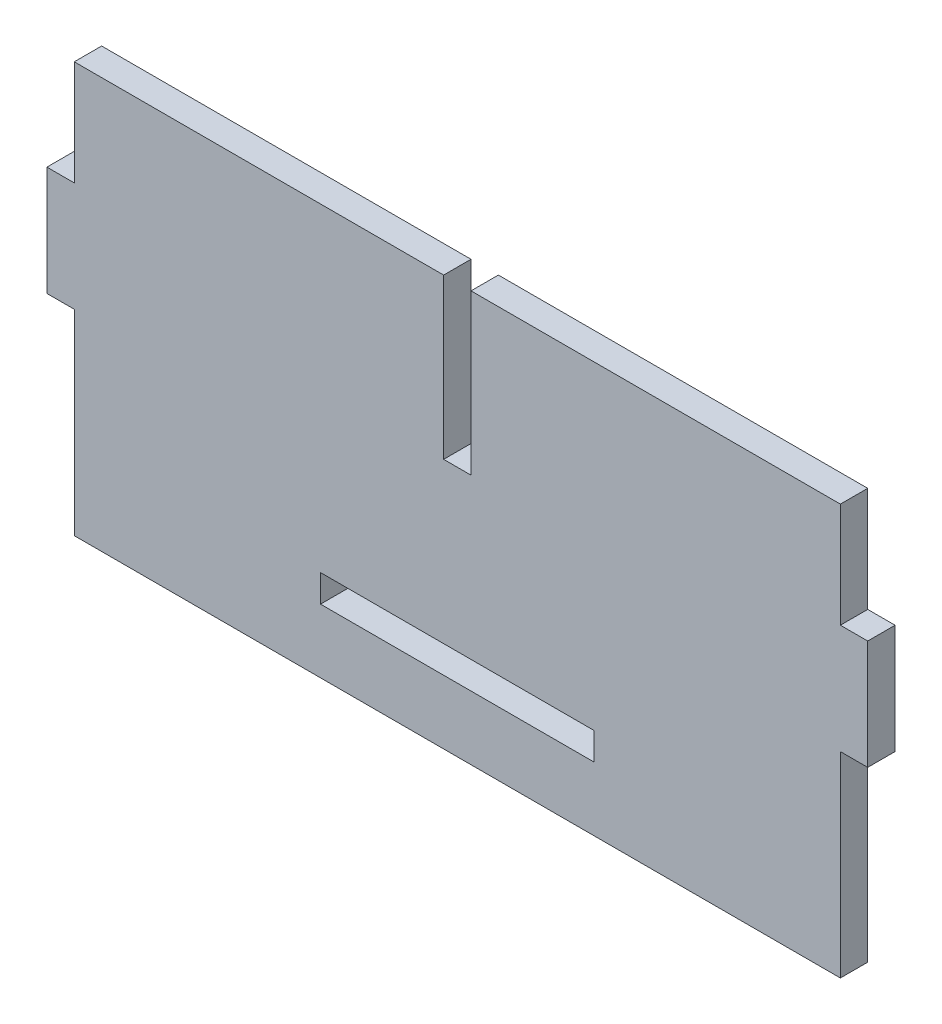
ISO-10303-21;
HEADER;
FILE_DESCRIPTION(('STEP AP214'),'2;1');
FILE_NAME('part.step','',(''),(''),'','','');
FILE_SCHEMA(('AUTOMOTIVE_DESIGN { 1 0 10303 214 1 1 1 1 }'));
ENDSEC;
DATA;
#1=APPLICATION_CONTEXT('core data for automotive mechanical design processes');
#2=APPLICATION_PROTOCOL_DEFINITION('international standard','automotive_design',2000,#1);
#3=PRODUCT_CONTEXT('',#1,'mechanical');
#4=PRODUCT('Part','Part','',(#3));
#5=PRODUCT_RELATED_PRODUCT_CATEGORY('part','',(#4));
#6=PRODUCT_DEFINITION_FORMATION('','',#4);
#7=PRODUCT_DEFINITION_CONTEXT('part definition',#1,'design');
#8=PRODUCT_DEFINITION('design','',#6,#7);
#9=PRODUCT_DEFINITION_SHAPE('','',#8);
#10=(LENGTH_UNIT() NAMED_UNIT(*) SI_UNIT(.MILLI.,.METRE.));
#11=(NAMED_UNIT(*) PLANE_ANGLE_UNIT() SI_UNIT($,.RADIAN.));
#12=(NAMED_UNIT(*) SI_UNIT($,.STERADIAN.) SOLID_ANGLE_UNIT());
#13=UNCERTAINTY_MEASURE_WITH_UNIT(LENGTH_MEASURE(1.E-05),#10,'distance_accuracy_value','');
#14=(GEOMETRIC_REPRESENTATION_CONTEXT(3) GLOBAL_UNCERTAINTY_ASSIGNED_CONTEXT((#13)) GLOBAL_UNIT_ASSIGNED_CONTEXT((#10,
#11,#12)) REPRESENTATION_CONTEXT('',''));
#15=CARTESIAN_POINT('',(0.,0.,0.));
#16=DIRECTION('',(0.,0.,1.));
#17=DIRECTION('',(1.,0.,0.));
#18=AXIS2_PLACEMENT_3D('',#15,#16,#17);
#19=CARTESIAN_POINT('',(1.5,0.,3.));
#20=DIRECTION('',(-1.,0.,0.));
#21=DIRECTION('',(0.,0.,1.));
#22=AXIS2_PLACEMENT_3D('',#19,#20,#21);
#23=PLANE('',#22);
#24=DIRECTION('',(0.,1.,0.));
#25=VECTOR('',#24,1.);
#26=CARTESIAN_POINT('',(1.5,0.,0.));
#27=LINE('',#26,#25);
#28=CARTESIAN_POINT('',(1.5,5.,0.));
#29=VERTEX_POINT('',#28);
#30=CARTESIAN_POINT('',(1.5,22.5,0.));
#31=VERTEX_POINT('',#30);
#32=EDGE_CURVE('E284',#29,#31,#27,.T.);
#33=ORIENTED_EDGE('',*,*,#32,.F.);
#34=DIRECTION('',(0.,0.,-1.));
#35=VECTOR('',#34,1.);
#36=CARTESIAN_POINT('',(1.5,5.,3.));
#37=LINE('',#36,#35);
#38=CARTESIAN_POINT('',(1.5,5.,3.));
#39=VERTEX_POINT('',#38);
#40=EDGE_CURVE('E11',#39,#29,#37,.T.);
#41=ORIENTED_EDGE('',*,*,#40,.F.);
#42=DIRECTION('',(0.,1.,0.));
#43=VECTOR('',#42,1.);
#44=CARTESIAN_POINT('',(1.5,0.,3.));
#45=LINE('',#44,#43);
#46=CARTESIAN_POINT('',(1.5,22.5,3.));
#47=VERTEX_POINT('',#46);
#48=EDGE_CURVE('E328',#39,#47,#45,.T.);
#49=ORIENTED_EDGE('',*,*,#48,.T.);
#50=DIRECTION('',(0.,0.,-1.));
#51=VECTOR('',#50,1.);
#52=CARTESIAN_POINT('',(1.5,22.5,3.));
#53=LINE('',#52,#51);
#54=EDGE_CURVE('E54',#47,#31,#53,.T.);
#55=ORIENTED_EDGE('',*,*,#54,.T.);
#56=EDGE_LOOP('',(#33,#41,#49,#55));
#57=FACE_BOUND('',#56,.T.);
#58=ADVANCED_FACE('F35',(#57),#23,.T.);
#59=CARTESIAN_POINT('',(0.,5.,3.));
#60=DIRECTION('',(0.,1.,0.));
#61=DIRECTION('',(0.,0.,1.));
#62=AXIS2_PLACEMENT_3D('',#59,#60,#61);
#63=PLANE('',#62);
#64=DIRECTION('',(1.,0.,0.));
#65=VECTOR('',#64,1.);
#66=CARTESIAN_POINT('',(0.,5.,0.));
#67=LINE('',#66,#65);
#68=CARTESIAN_POINT('',(-1.5,5.,0.));
#69=VERTEX_POINT('',#68);
#70=EDGE_CURVE('E281',#69,#29,#67,.T.);
#71=ORIENTED_EDGE('',*,*,#70,.F.);
#72=DIRECTION('',(0.,0.,-1.));
#73=VECTOR('',#72,1.);
#74=CARTESIAN_POINT('',(-1.5,5.,3.));
#75=LINE('',#74,#73);
#76=CARTESIAN_POINT('',(-1.5,5.,3.));
#77=VERTEX_POINT('',#76);
#78=EDGE_CURVE('E45',#77,#69,#75,.T.);
#79=ORIENTED_EDGE('',*,*,#78,.F.);
#80=DIRECTION('',(1.,0.,0.));
#81=VECTOR('',#80,1.);
#82=CARTESIAN_POINT('',(0.,5.,3.));
#83=LINE('',#82,#81);
#84=EDGE_CURVE('E325',#77,#39,#83,.T.);
#85=ORIENTED_EDGE('',*,*,#84,.T.);
#86=ORIENTED_EDGE('',*,*,#40,.T.);
#87=EDGE_LOOP('',(#71,#79,#85,#86));
#88=FACE_BOUND('',#87,.T.);
#89=ADVANCED_FACE('F361',(#88),#63,.T.);
#90=CARTESIAN_POINT('',(-1.5,0.,3.));
#91=DIRECTION('',(-1.,0.,0.));
#92=DIRECTION('',(0.,0.,1.));
#93=AXIS2_PLACEMENT_3D('',#90,#91,#92);
#94=PLANE('',#93);
#95=DIRECTION('',(0.,1.,0.));
#96=VECTOR('',#95,1.);
#97=CARTESIAN_POINT('',(-1.5,0.,0.));
#98=LINE('',#97,#96);
#99=CARTESIAN_POINT('',(-1.5,22.5,0.));
#100=VERTEX_POINT('',#99);
#101=EDGE_CURVE('E278',#69,#100,#98,.T.);
#102=ORIENTED_EDGE('',*,*,#101,.T.);
#103=DIRECTION('',(0.,0.,-1.));
#104=VECTOR('',#103,1.);
#105=CARTESIAN_POINT('',(-1.5,22.5,3.));
#106=LINE('',#105,#104);
#107=CARTESIAN_POINT('',(-1.5,22.5,3.));
#108=VERTEX_POINT('',#107);
#109=EDGE_CURVE('E229',#108,#100,#106,.T.);
#110=ORIENTED_EDGE('',*,*,#109,.F.);
#111=DIRECTION('',(0.,1.,0.));
#112=VECTOR('',#111,1.);
#113=CARTESIAN_POINT('',(-1.5,0.,3.));
#114=LINE('',#113,#112);
#115=EDGE_CURVE('E323',#77,#108,#114,.T.);
#116=ORIENTED_EDGE('',*,*,#115,.F.);
#117=ORIENTED_EDGE('',*,*,#78,.T.);
#118=EDGE_LOOP('',(#102,#110,#116,#117));
#119=FACE_BOUND('',#118,.T.);
#120=ADVANCED_FACE('F358',(#119),#94,.F.);
#121=CARTESIAN_POINT('',(0.,22.5,3.));
#122=DIRECTION('',(0.,1.,0.));
#123=DIRECTION('',(-1.,0.,0.));
#124=AXIS2_PLACEMENT_3D('',#121,#122,#123);
#125=PLANE('',#124);
#126=DIRECTION('',(1.,0.,0.));
#127=VECTOR('',#126,1.);
#128=CARTESIAN_POINT('',(0.,22.5,0.));
#129=LINE('',#128,#127);
#130=CARTESIAN_POINT('',(-42.,22.5,0.));
#131=VERTEX_POINT('',#130);
#132=EDGE_CURVE('E275',#131,#100,#129,.T.);
#133=ORIENTED_EDGE('',*,*,#132,.F.);
#134=DIRECTION('',(0.,0.,-1.));
#135=VECTOR('',#134,1.);
#136=CARTESIAN_POINT('',(-42.,22.5,3.));
#137=LINE('',#136,#135);
#138=CARTESIAN_POINT('',(-42.,22.5,3.));
#139=VERTEX_POINT('',#138);
#140=EDGE_CURVE('E227',#139,#131,#137,.T.);
#141=ORIENTED_EDGE('',*,*,#140,.F.);
#142=DIRECTION('',(1.,0.,0.));
#143=VECTOR('',#142,1.);
#144=CARTESIAN_POINT('',(0.,22.5,3.));
#145=LINE('',#144,#143);
#146=EDGE_CURVE('E320',#139,#108,#145,.T.);
#147=ORIENTED_EDGE('',*,*,#146,.T.);
#148=ORIENTED_EDGE('',*,*,#109,.T.);
#149=EDGE_LOOP('',(#133,#141,#147,#148));
#150=FACE_BOUND('',#149,.T.);
#151=ADVANCED_FACE('F344',(#150),#125,.T.);
#152=CARTESIAN_POINT('',(-42.,0.,3.));
#153=DIRECTION('',(1.,0.,0.));
#154=DIRECTION('',(0.,0.,-1.));
#155=AXIS2_PLACEMENT_3D('',#152,#153,#154);
#156=PLANE('',#155);
#157=DIRECTION('',(0.,-1.,0.));
#158=VECTOR('',#157,1.);
#159=CARTESIAN_POINT('',(-42.,0.,0.));
#160=LINE('',#159,#158);
#161=CARTESIAN_POINT('',(-42.,11.,0.));
#162=VERTEX_POINT('',#161);
#163=EDGE_CURVE('E272',#131,#162,#160,.T.);
#164=ORIENTED_EDGE('',*,*,#163,.T.);
#165=DIRECTION('',(0.,0.,-1.));
#166=VECTOR('',#165,1.);
#167=CARTESIAN_POINT('',(-42.,11.,3.));
#168=LINE('',#167,#166);
#169=CARTESIAN_POINT('',(-42.,11.,3.));
#170=VERTEX_POINT('',#169);
#171=EDGE_CURVE('E224',#170,#162,#168,.T.);
#172=ORIENTED_EDGE('',*,*,#171,.F.);
#173=DIRECTION('',(0.,-1.,0.));
#174=VECTOR('',#173,1.);
#175=CARTESIAN_POINT('',(-42.,0.,3.));
#176=LINE('',#175,#174);
#177=EDGE_CURVE('E317',#139,#170,#176,.T.);
#178=ORIENTED_EDGE('',*,*,#177,.F.);
#179=ORIENTED_EDGE('',*,*,#140,.T.);
#180=EDGE_LOOP('',(#164,#172,#178,#179));
#181=FACE_BOUND('',#180,.T.);
#182=ADVANCED_FACE('F357',(#181),#156,.F.);
#183=CARTESIAN_POINT('',(0.,11.,3.));
#184=DIRECTION('',(0.,-1.,0.));
#185=DIRECTION('',(0.,0.,-1.));
#186=AXIS2_PLACEMENT_3D('',#183,#184,#185);
#187=PLANE('',#186);
#188=DIRECTION('',(-1.,0.,0.));
#189=VECTOR('',#188,1.);
#190=CARTESIAN_POINT('',(0.,11.,0.));
#191=LINE('',#190,#189);
#192=CARTESIAN_POINT('',(-45.,11.,0.));
#193=VERTEX_POINT('',#192);
#194=EDGE_CURVE('E269',#162,#193,#191,.T.);
#195=ORIENTED_EDGE('',*,*,#194,.T.);
#196=DIRECTION('',(0.,0.,-1.));
#197=VECTOR('',#196,1.);
#198=CARTESIAN_POINT('',(-45.,11.,3.));
#199=LINE('',#198,#197);
#200=CARTESIAN_POINT('',(-45.,11.,3.));
#201=VERTEX_POINT('',#200);
#202=EDGE_CURVE('E222',#201,#193,#199,.T.);
#203=ORIENTED_EDGE('',*,*,#202,.F.);
#204=DIRECTION('',(-1.,0.,0.));
#205=VECTOR('',#204,1.);
#206=CARTESIAN_POINT('',(0.,11.,3.));
#207=LINE('',#206,#205);
#208=EDGE_CURVE('E315',#170,#201,#207,.T.);
#209=ORIENTED_EDGE('',*,*,#208,.F.);
#210=ORIENTED_EDGE('',*,*,#171,.T.);
#211=EDGE_LOOP('',(#195,#203,#209,#210));
#212=FACE_BOUND('',#211,.T.);
#213=ADVANCED_FACE('F500',(#212),#187,.F.);
#214=CARTESIAN_POINT('',(-45.,0.,3.));
#215=DIRECTION('',(-1.,0.,0.));
#216=DIRECTION('',(0.,0.,1.));
#217=AXIS2_PLACEMENT_3D('',#214,#215,#216);
#218=PLANE('',#217);
#219=DIRECTION('',(0.,1.,0.));
#220=VECTOR('',#219,1.);
#221=CARTESIAN_POINT('',(-45.,0.,0.));
#222=LINE('',#221,#220);
#223=CARTESIAN_POINT('',(-45.,-0.999999999999994,0.));
#224=VERTEX_POINT('',#223);
#225=EDGE_CURVE('E266',#224,#193,#222,.T.);
#226=ORIENTED_EDGE('',*,*,#225,.F.);
#227=DIRECTION('',(0.,0.,-1.));
#228=VECTOR('',#227,1.);
#229=CARTESIAN_POINT('',(-45.,-0.999999999999994,3.));
#230=LINE('',#229,#228);
#231=CARTESIAN_POINT('',(-45.,-0.999999999999994,3.));
#232=VERTEX_POINT('',#231);
#233=EDGE_CURVE('E220',#232,#224,#230,.T.);
#234=ORIENTED_EDGE('',*,*,#233,.F.);
#235=DIRECTION('',(0.,1.,0.));
#236=VECTOR('',#235,1.);
#237=CARTESIAN_POINT('',(-45.,0.,3.));
#238=LINE('',#237,#236);
#239=EDGE_CURVE('E312',#232,#201,#238,.T.);
#240=ORIENTED_EDGE('',*,*,#239,.T.);
#241=ORIENTED_EDGE('',*,*,#202,.T.);
#242=EDGE_LOOP('',(#226,#234,#240,#241));
#243=FACE_BOUND('',#242,.T.);
#244=ADVANCED_FACE('F490',(#243),#218,.T.);
#245=CARTESIAN_POINT('',(0.,-0.999999999999994,3.));
#246=DIRECTION('',(0.,1.,0.));
#247=DIRECTION('',(0.,0.,1.));
#248=AXIS2_PLACEMENT_3D('',#245,#246,#247);
#249=PLANE('',#248);
#250=DIRECTION('',(1.,0.,0.));
#251=VECTOR('',#250,1.);
#252=CARTESIAN_POINT('',(0.,-0.999999999999994,0.));
#253=LINE('',#252,#251);
#254=CARTESIAN_POINT('',(-42.,-0.999999999999994,0.));
#255=VERTEX_POINT('',#254);
#256=EDGE_CURVE('E263',#224,#255,#253,.T.);
#257=ORIENTED_EDGE('',*,*,#256,.T.);
#258=DIRECTION('',(0.,0.,-1.));
#259=VECTOR('',#258,1.);
#260=CARTESIAN_POINT('',(-42.,-0.999999999999994,3.));
#261=LINE('',#260,#259);
#262=CARTESIAN_POINT('',(-42.,-0.999999999999994,3.));
#263=VERTEX_POINT('',#262);
#264=EDGE_CURVE('E217',#263,#255,#261,.T.);
#265=ORIENTED_EDGE('',*,*,#264,.F.);
#266=DIRECTION('',(1.,0.,0.));
#267=VECTOR('',#266,1.);
#268=CARTESIAN_POINT('',(0.,-0.999999999999994,3.));
#269=LINE('',#268,#267);
#270=EDGE_CURVE('E309',#232,#263,#269,.T.);
#271=ORIENTED_EDGE('',*,*,#270,.F.);
#272=ORIENTED_EDGE('',*,*,#233,.T.);
#273=EDGE_LOOP('',(#257,#265,#271,#272));
#274=FACE_BOUND('',#273,.T.);
#275=ADVANCED_FACE('F480',(#274),#249,.F.);
#276=CARTESIAN_POINT('',(-42.,0.,3.));
#277=DIRECTION('',(1.,0.,0.));
#278=DIRECTION('',(0.,0.,-1.));
#279=AXIS2_PLACEMENT_3D('',#276,#277,#278);
#280=PLANE('',#279);
#281=DIRECTION('',(0.,-1.,0.));
#282=VECTOR('',#281,1.);
#283=CARTESIAN_POINT('',(-42.,0.,0.));
#284=LINE('',#283,#282);
#285=CARTESIAN_POINT('',(-42.,-22.5,0.));
#286=VERTEX_POINT('',#285);
#287=EDGE_CURVE('E260',#255,#286,#284,.T.);
#288=ORIENTED_EDGE('',*,*,#287,.T.);
#289=DIRECTION('',(0.,0.,-1.));
#290=VECTOR('',#289,1.);
#291=CARTESIAN_POINT('',(-42.,-22.5,3.));
#292=LINE('',#291,#290);
#293=CARTESIAN_POINT('',(-42.,-22.5,3.));
#294=VERTEX_POINT('',#293);
#295=EDGE_CURVE('E214',#294,#286,#292,.T.);
#296=ORIENTED_EDGE('',*,*,#295,.F.);
#297=DIRECTION('',(0.,-1.,0.));
#298=VECTOR('',#297,1.);
#299=CARTESIAN_POINT('',(-42.,0.,3.));
#300=LINE('',#299,#298);
#301=EDGE_CURVE('E306',#263,#294,#300,.T.);
#302=ORIENTED_EDGE('',*,*,#301,.F.);
#303=ORIENTED_EDGE('',*,*,#264,.T.);
#304=EDGE_LOOP('',(#288,#296,#302,#303));
#305=FACE_BOUND('',#304,.T.);
#306=ADVANCED_FACE('F470',(#305),#280,.F.);
#307=CARTESIAN_POINT('',(0.,-22.5,3.));
#308=DIRECTION('',(0.,1.,0.));
#309=DIRECTION('',(0.,0.,1.));
#310=AXIS2_PLACEMENT_3D('',#307,#308,#309);
#311=PLANE('',#310);
#312=DIRECTION('',(1.,0.,0.));
#313=VECTOR('',#312,1.);
#314=CARTESIAN_POINT('',(0.,-22.5,0.));
#315=LINE('',#314,#313);
#316=CARTESIAN_POINT('',(42.,-22.5,0.));
#317=VERTEX_POINT('',#316);
#318=EDGE_CURVE('E257',#286,#317,#315,.T.);
#319=ORIENTED_EDGE('',*,*,#318,.T.);
#320=DIRECTION('',(0.,0.,-1.));
#321=VECTOR('',#320,1.);
#322=CARTESIAN_POINT('',(42.,-22.5,3.));
#323=LINE('',#322,#321);
#324=CARTESIAN_POINT('',(42.,-22.5,3.));
#325=VERTEX_POINT('',#324);
#326=EDGE_CURVE('E212',#325,#317,#323,.T.);
#327=ORIENTED_EDGE('',*,*,#326,.F.);
#328=DIRECTION('',(1.,0.,0.));
#329=VECTOR('',#328,1.);
#330=CARTESIAN_POINT('',(0.,-22.5,3.));
#331=LINE('',#330,#329);
#332=EDGE_CURVE('E304',#294,#325,#331,.T.);
#333=ORIENTED_EDGE('',*,*,#332,.F.);
#334=ORIENTED_EDGE('',*,*,#295,.T.);
#335=EDGE_LOOP('',(#319,#327,#333,#334));
#336=FACE_BOUND('',#335,.T.);
#337=ADVANCED_FACE('F460',(#336),#311,.F.);
#338=CARTESIAN_POINT('',(42.,0.,3.));
#339=DIRECTION('',(1.,0.,0.));
#340=DIRECTION('',(0.,0.,-1.));
#341=AXIS2_PLACEMENT_3D('',#338,#339,#340);
#342=PLANE('',#341);
#343=DIRECTION('',(0.,-1.,0.));
#344=VECTOR('',#343,1.);
#345=CARTESIAN_POINT('',(42.,0.,0.));
#346=LINE('',#345,#344);
#347=CARTESIAN_POINT('',(42.,-0.999999999999994,0.));
#348=VERTEX_POINT('',#347);
#349=EDGE_CURVE('E254',#348,#317,#346,.T.);
#350=ORIENTED_EDGE('',*,*,#349,.F.);
#351=DIRECTION('',(0.,0.,-1.));
#352=VECTOR('',#351,1.);
#353=CARTESIAN_POINT('',(42.,-0.999999999999994,3.));
#354=LINE('',#353,#352);
#355=CARTESIAN_POINT('',(42.,-0.999999999999994,3.));
#356=VERTEX_POINT('',#355);
#357=EDGE_CURVE('E210',#356,#348,#354,.T.);
#358=ORIENTED_EDGE('',*,*,#357,.F.);
#359=DIRECTION('',(0.,-1.,0.));
#360=VECTOR('',#359,1.);
#361=CARTESIAN_POINT('',(42.,0.,3.));
#362=LINE('',#361,#360);
#363=EDGE_CURVE('E301',#356,#325,#362,.T.);
#364=ORIENTED_EDGE('',*,*,#363,.T.);
#365=ORIENTED_EDGE('',*,*,#326,.T.);
#366=EDGE_LOOP('',(#350,#358,#364,#365));
#367=FACE_BOUND('',#366,.T.);
#368=ADVANCED_FACE('F450',(#367),#342,.T.);
#369=CARTESIAN_POINT('',(0.,-0.999999999999994,3.));
#370=DIRECTION('',(0.,-1.,0.));
#371=DIRECTION('',(0.,0.,-1.));
#372=AXIS2_PLACEMENT_3D('',#369,#370,#371);
#373=PLANE('',#372);
#374=DIRECTION('',(-1.,0.,0.));
#375=VECTOR('',#374,1.);
#376=CARTESIAN_POINT('',(0.,-0.999999999999994,0.));
#377=LINE('',#376,#375);
#378=CARTESIAN_POINT('',(45.,-0.999999999999994,0.));
#379=VERTEX_POINT('',#378);
#380=EDGE_CURVE('E251',#379,#348,#377,.T.);
#381=ORIENTED_EDGE('',*,*,#380,.F.);
#382=DIRECTION('',(0.,0.,-1.));
#383=VECTOR('',#382,1.);
#384=CARTESIAN_POINT('',(45.,-0.999999999999994,3.));
#385=LINE('',#384,#383);
#386=CARTESIAN_POINT('',(45.,-0.999999999999994,3.));
#387=VERTEX_POINT('',#386);
#388=EDGE_CURVE('E204',#387,#379,#385,.T.);
#389=ORIENTED_EDGE('',*,*,#388,.F.);
#390=DIRECTION('',(-1.,0.,0.));
#391=VECTOR('',#390,1.);
#392=CARTESIAN_POINT('',(0.,-0.999999999999994,3.));
#393=LINE('',#392,#391);
#394=EDGE_CURVE('E298',#387,#356,#393,.T.);
#395=ORIENTED_EDGE('',*,*,#394,.T.);
#396=ORIENTED_EDGE('',*,*,#357,.T.);
#397=EDGE_LOOP('',(#381,#389,#395,#396));
#398=FACE_BOUND('',#397,.T.);
#399=ADVANCED_FACE('F440',(#398),#373,.T.);
#400=CARTESIAN_POINT('',(45.,0.,3.));
#401=DIRECTION('',(-1.,0.,0.));
#402=DIRECTION('',(0.,0.,1.));
#403=AXIS2_PLACEMENT_3D('',#400,#401,#402);
#404=PLANE('',#403);
#405=DIRECTION('',(0.,1.,0.));
#406=VECTOR('',#405,1.);
#407=CARTESIAN_POINT('',(45.,0.,0.));
#408=LINE('',#407,#406);
#409=CARTESIAN_POINT('',(45.,11.,0.));
#410=VERTEX_POINT('',#409);
#411=EDGE_CURVE('E248',#379,#410,#408,.T.);
#412=ORIENTED_EDGE('',*,*,#411,.T.);
#413=DIRECTION('',(0.,0.,-1.));
#414=VECTOR('',#413,1.);
#415=CARTESIAN_POINT('',(45.,11.,3.));
#416=LINE('',#415,#414);
#417=CARTESIAN_POINT('',(45.,11.,3.));
#418=VERTEX_POINT('',#417);
#419=EDGE_CURVE('E202',#418,#410,#416,.T.);
#420=ORIENTED_EDGE('',*,*,#419,.F.);
#421=DIRECTION('',(0.,1.,0.));
#422=VECTOR('',#421,1.);
#423=CARTESIAN_POINT('',(45.,0.,3.));
#424=LINE('',#423,#422);
#425=EDGE_CURVE('E195',#387,#418,#424,.T.);
#426=ORIENTED_EDGE('',*,*,#425,.F.);
#427=ORIENTED_EDGE('',*,*,#388,.T.);
#428=EDGE_LOOP('',(#412,#420,#426,#427));
#429=FACE_BOUND('',#428,.T.);
#430=ADVANCED_FACE('F431',(#429),#404,.F.);
#431=CARTESIAN_POINT('',(0.,11.,3.));
#432=DIRECTION('',(0.,-1.,0.));
#433=DIRECTION('',(0.,0.,-1.));
#434=AXIS2_PLACEMENT_3D('',#431,#432,#433);
#435=PLANE('',#434);
#436=DIRECTION('',(-1.,0.,0.));
#437=VECTOR('',#436,1.);
#438=CARTESIAN_POINT('',(0.,11.,0.));
#439=LINE('',#438,#437);
#440=CARTESIAN_POINT('',(42.,11.,0.));
#441=VERTEX_POINT('',#440);
#442=EDGE_CURVE('E201',#410,#441,#439,.T.);
#443=ORIENTED_EDGE('',*,*,#442,.T.);
#444=DIRECTION('',(0.,0.,-1.));
#445=VECTOR('',#444,1.);
#446=CARTESIAN_POINT('',(42.,11.,3.));
#447=LINE('',#446,#445);
#448=CARTESIAN_POINT('',(42.,11.,3.));
#449=VERTEX_POINT('',#448);
#450=EDGE_CURVE('E183',#449,#441,#447,.T.);
#451=ORIENTED_EDGE('',*,*,#450,.F.);
#452=DIRECTION('',(-1.,0.,0.));
#453=VECTOR('',#452,1.);
#454=CARTESIAN_POINT('',(0.,11.,3.));
#455=LINE('',#454,#453);
#456=EDGE_CURVE('E188',#418,#449,#455,.T.);
#457=ORIENTED_EDGE('',*,*,#456,.F.);
#458=ORIENTED_EDGE('',*,*,#419,.T.);
#459=EDGE_LOOP('',(#443,#451,#457,#458));
#460=FACE_BOUND('',#459,.T.);
#461=ADVANCED_FACE('F200',(#460),#435,.F.);
#462=CARTESIAN_POINT('',(42.,0.,3.));
#463=DIRECTION('',(-1.,0.,0.));
#464=DIRECTION('',(0.,0.,1.));
#465=AXIS2_PLACEMENT_3D('',#462,#463,#464);
#466=PLANE('',#465);
#467=DIRECTION('',(0.,1.,0.));
#468=VECTOR('',#467,1.);
#469=CARTESIAN_POINT('',(42.,0.,0.));
#470=LINE('',#469,#468);
#471=CARTESIAN_POINT('',(42.,22.5,0.));
#472=VERTEX_POINT('',#471);
#473=EDGE_CURVE('E244',#441,#472,#470,.T.);
#474=ORIENTED_EDGE('',*,*,#473,.T.);
#475=DIRECTION('',(0.,0.,-1.));
#476=VECTOR('',#475,1.);
#477=CARTESIAN_POINT('',(42.,22.5,3.));
#478=LINE('',#477,#476);
#479=CARTESIAN_POINT('',(42.,22.5,3.));
#480=VERTEX_POINT('',#479);
#481=EDGE_CURVE('E116',#480,#472,#478,.T.);
#482=ORIENTED_EDGE('',*,*,#481,.F.);
#483=DIRECTION('',(0.,1.,0.));
#484=VECTOR('',#483,1.);
#485=CARTESIAN_POINT('',(42.,0.,3.));
#486=LINE('',#485,#484);
#487=EDGE_CURVE('E179',#449,#480,#486,.T.);
#488=ORIENTED_EDGE('',*,*,#487,.F.);
#489=ORIENTED_EDGE('',*,*,#450,.T.);
#490=EDGE_LOOP('',(#474,#482,#488,#489));
#491=FACE_BOUND('',#490,.T.);
#492=ADVANCED_FACE('F181',(#491),#466,.F.);
#493=CARTESIAN_POINT('',(15.,0.,3.));
#494=DIRECTION('',(-1.,0.,0.));
#495=DIRECTION('',(0.,0.,1.));
#496=AXIS2_PLACEMENT_3D('',#493,#494,#495);
#497=PLANE('',#496);
#498=DIRECTION('',(0.,1.,0.));
#499=VECTOR('',#498,1.);
#500=CARTESIAN_POINT('',(15.,0.,0.));
#501=LINE('',#500,#499);
#502=CARTESIAN_POINT('',(15.,-15.5,0.));
#503=VERTEX_POINT('',#502);
#504=CARTESIAN_POINT('',(15.,-12.5,0.));
#505=VERTEX_POINT('',#504);
#506=EDGE_CURVE('E294',#503,#505,#501,.T.);
#507=ORIENTED_EDGE('',*,*,#506,.F.);
#508=DIRECTION('',(0.,0.,-1.));
#509=VECTOR('',#508,1.);
#510=CARTESIAN_POINT('',(15.,-15.5,3.));
#511=LINE('',#510,#509);
#512=CARTESIAN_POINT('',(15.,-15.5,3.));
#513=VERTEX_POINT('',#512);
#514=EDGE_CURVE('E39',#513,#503,#511,.T.);
#515=ORIENTED_EDGE('',*,*,#514,.F.);
#516=DIRECTION('',(0.,1.,0.));
#517=VECTOR('',#516,1.);
#518=CARTESIAN_POINT('',(15.,0.,3.));
#519=LINE('',#518,#517);
#520=CARTESIAN_POINT('',(15.,-12.5,3.));
#521=VERTEX_POINT('',#520);
#522=EDGE_CURVE('E336',#513,#521,#519,.T.);
#523=ORIENTED_EDGE('',*,*,#522,.T.);
#524=DIRECTION('',(0.,0.,-1.));
#525=VECTOR('',#524,1.);
#526=CARTESIAN_POINT('',(15.,-12.5,3.));
#527=LINE('',#526,#525);
#528=EDGE_CURVE('E232',#521,#505,#527,.T.);
#529=ORIENTED_EDGE('',*,*,#528,.T.);
#530=EDGE_LOOP('',(#507,#515,#523,#529));
#531=FACE_BOUND('',#530,.T.);
#532=ADVANCED_FACE('F37',(#531),#497,.T.);
#533=CARTESIAN_POINT('',(0.,-15.5,3.));
#534=DIRECTION('',(0.,1.,0.));
#535=DIRECTION('',(0.,0.,1.));
#536=AXIS2_PLACEMENT_3D('',#533,#534,#535);
#537=PLANE('',#536);
#538=DIRECTION('',(1.,0.,0.));
#539=VECTOR('',#538,1.);
#540=CARTESIAN_POINT('',(0.,-15.5,0.));
#541=LINE('',#540,#539);
#542=CARTESIAN_POINT('',(-15.,-15.5,0.));
#543=VERTEX_POINT('',#542);
#544=EDGE_CURVE('E291',#543,#503,#541,.T.);
#545=ORIENTED_EDGE('',*,*,#544,.F.);
#546=DIRECTION('',(0.,0.,-1.));
#547=VECTOR('',#546,1.);
#548=CARTESIAN_POINT('',(-15.,-15.5,3.));
#549=LINE('',#548,#547);
#550=CARTESIAN_POINT('',(-15.,-15.5,3.));
#551=VERTEX_POINT('',#550);
#552=EDGE_CURVE('E236',#551,#543,#549,.T.);
#553=ORIENTED_EDGE('',*,*,#552,.F.);
#554=DIRECTION('',(1.,0.,0.));
#555=VECTOR('',#554,1.);
#556=CARTESIAN_POINT('',(0.,-15.5,3.));
#557=LINE('',#556,#555);
#558=EDGE_CURVE('E334',#551,#513,#557,.T.);
#559=ORIENTED_EDGE('',*,*,#558,.T.);
#560=ORIENTED_EDGE('',*,*,#514,.T.);
#561=EDGE_LOOP('',(#545,#553,#559,#560));
#562=FACE_BOUND('',#561,.T.);
#563=ADVANCED_FACE('F371',(#562),#537,.T.);
#564=CARTESIAN_POINT('',(-15.,0.,3.));
#565=DIRECTION('',(-1.,0.,0.));
#566=DIRECTION('',(0.,0.,1.));
#567=AXIS2_PLACEMENT_3D('',#564,#565,#566);
#568=PLANE('',#567);
#569=DIRECTION('',(0.,1.,0.));
#570=VECTOR('',#569,1.);
#571=CARTESIAN_POINT('',(-15.,0.,0.));
#572=LINE('',#571,#570);
#573=CARTESIAN_POINT('',(-15.,-12.5,0.));
#574=VERTEX_POINT('',#573);
#575=EDGE_CURVE('E289',#543,#574,#572,.T.);
#576=ORIENTED_EDGE('',*,*,#575,.T.);
#577=DIRECTION('',(0.,0.,-1.));
#578=VECTOR('',#577,1.);
#579=CARTESIAN_POINT('',(-15.,-12.5,3.));
#580=LINE('',#579,#578);
#581=CARTESIAN_POINT('',(-15.,-12.5,3.));
#582=VERTEX_POINT('',#581);
#583=EDGE_CURVE('E234',#582,#574,#580,.T.);
#584=ORIENTED_EDGE('',*,*,#583,.F.);
#585=DIRECTION('',(0.,1.,0.));
#586=VECTOR('',#585,1.);
#587=CARTESIAN_POINT('',(-15.,0.,3.));
#588=LINE('',#587,#586);
#589=EDGE_CURVE('E332',#551,#582,#588,.T.);
#590=ORIENTED_EDGE('',*,*,#589,.F.);
#591=ORIENTED_EDGE('',*,*,#552,.T.);
#592=EDGE_LOOP('',(#576,#584,#590,#591));
#593=FACE_BOUND('',#592,.T.);
#594=ADVANCED_FACE('F351',(#593),#568,.F.);
#595=CARTESIAN_POINT('',(0.,-12.5,3.));
#596=DIRECTION('',(0.,1.,0.));
#597=DIRECTION('',(0.,0.,1.));
#598=AXIS2_PLACEMENT_3D('',#595,#596,#597);
#599=PLANE('',#598);
#600=DIRECTION('',(1.,0.,0.));
#601=VECTOR('',#600,1.);
#602=CARTESIAN_POINT('',(0.,-12.5,0.));
#603=LINE('',#602,#601);
#604=EDGE_CURVE('E286',#574,#505,#603,.T.);
#605=ORIENTED_EDGE('',*,*,#604,.T.);
#606=ORIENTED_EDGE('',*,*,#528,.F.);
#607=DIRECTION('',(1.,0.,0.));
#608=VECTOR('',#607,1.);
#609=CARTESIAN_POINT('',(0.,-12.5,3.));
#610=LINE('',#609,#608);
#611=EDGE_CURVE('E330',#582,#521,#610,.T.);
#612=ORIENTED_EDGE('',*,*,#611,.F.);
#613=ORIENTED_EDGE('',*,*,#583,.T.);
#614=EDGE_LOOP('',(#605,#606,#612,#613));
#615=FACE_BOUND('',#614,.T.);
#616=ADVANCED_FACE('F342',(#615),#599,.F.);
#617=EDGE_CURVE('E246',#31,#472,#129,.T.);
#618=ORIENTED_EDGE('',*,*,#617,.F.);
#619=ORIENTED_EDGE('',*,*,#54,.F.);
#620=EDGE_CURVE('E187',#47,#480,#145,.T.);
#621=ORIENTED_EDGE('',*,*,#620,.T.);
#622=ORIENTED_EDGE('',*,*,#481,.T.);
#623=EDGE_LOOP('',(#618,#619,#621,#622));
#624=FACE_BOUND('',#623,.T.);
#625=ADVANCED_FACE('F340',(#624),#125,.T.);
#626=CARTESIAN_POINT('',(0.,0.,3.));
#627=DIRECTION('',(0.,0.,1.));
#628=DIRECTION('',(1.,0.,0.));
#629=AXIS2_PLACEMENT_3D('',#626,#627,#628);
#630=PLANE('',#629);
#631=ORIENTED_EDGE('',*,*,#522,.F.);
#632=ORIENTED_EDGE('',*,*,#558,.F.);
#633=ORIENTED_EDGE('',*,*,#589,.T.);
#634=ORIENTED_EDGE('',*,*,#611,.T.);
#635=EDGE_LOOP('',(#631,#632,#633,#634));
#636=FACE_BOUND('',#635,.T.);
#637=ORIENTED_EDGE('',*,*,#48,.F.);
#638=ORIENTED_EDGE('',*,*,#84,.F.);
#639=ORIENTED_EDGE('',*,*,#115,.T.);
#640=ORIENTED_EDGE('',*,*,#146,.F.);
#641=ORIENTED_EDGE('',*,*,#177,.T.);
#642=ORIENTED_EDGE('',*,*,#208,.T.);
#643=ORIENTED_EDGE('',*,*,#239,.F.);
#644=ORIENTED_EDGE('',*,*,#270,.T.);
#645=ORIENTED_EDGE('',*,*,#301,.T.);
#646=ORIENTED_EDGE('',*,*,#332,.T.);
#647=ORIENTED_EDGE('',*,*,#363,.F.);
#648=ORIENTED_EDGE('',*,*,#394,.F.);
#649=ORIENTED_EDGE('',*,*,#425,.T.);
#650=ORIENTED_EDGE('',*,*,#456,.T.);
#651=ORIENTED_EDGE('',*,*,#487,.T.);
#652=ORIENTED_EDGE('',*,*,#620,.F.);
#653=EDGE_LOOP('',(#637,#638,#639,#640,#641,#642,#643,#644,#645,#646,#647,#648,#649,#650,#651,#652));
#654=FACE_BOUND('',#653,.T.);
#655=ADVANCED_FACE('F192',(#636,#654),#630,.T.);
#656=CARTESIAN_POINT('',(0.,0.,0.));
#657=DIRECTION('',(0.,0.,1.));
#658=DIRECTION('',(1.,0.,0.));
#659=AXIS2_PLACEMENT_3D('',#656,#657,#658);
#660=PLANE('',#659);
#661=ORIENTED_EDGE('',*,*,#506,.T.);
#662=ORIENTED_EDGE('',*,*,#604,.F.);
#663=ORIENTED_EDGE('',*,*,#575,.F.);
#664=ORIENTED_EDGE('',*,*,#544,.T.);
#665=EDGE_LOOP('',(#661,#662,#663,#664));
#666=FACE_BOUND('',#665,.T.);
#667=ORIENTED_EDGE('',*,*,#32,.T.);
#668=ORIENTED_EDGE('',*,*,#617,.T.);
#669=ORIENTED_EDGE('',*,*,#473,.F.);
#670=ORIENTED_EDGE('',*,*,#442,.F.);
#671=ORIENTED_EDGE('',*,*,#411,.F.);
#672=ORIENTED_EDGE('',*,*,#380,.T.);
#673=ORIENTED_EDGE('',*,*,#349,.T.);
#674=ORIENTED_EDGE('',*,*,#318,.F.);
#675=ORIENTED_EDGE('',*,*,#287,.F.);
#676=ORIENTED_EDGE('',*,*,#256,.F.);
#677=ORIENTED_EDGE('',*,*,#225,.T.);
#678=ORIENTED_EDGE('',*,*,#194,.F.);
#679=ORIENTED_EDGE('',*,*,#163,.F.);
#680=ORIENTED_EDGE('',*,*,#132,.T.);
#681=ORIENTED_EDGE('',*,*,#101,.F.);
#682=ORIENTED_EDGE('',*,*,#70,.T.);
#683=EDGE_LOOP('',(#667,#668,#669,#670,#671,#672,#673,#674,#675,#676,#677,#678,#679,#680,#681,#682));
#684=FACE_BOUND('',#683,.T.);
#685=ADVANCED_FACE('F339',(#666,#684),#660,.F.);
#686=CLOSED_SHELL('',(#58,#89,#120,#151,#182,#213,#244,#275,#306,#337,#368,#399,#430,#461,#492,
#532,#563,#594,#616,#625,#655,#685));
#687=MANIFOLD_SOLID_BREP('B2',#686);
#688=ADVANCED_BREP_SHAPE_REPRESENTATION('',(#18,#687),#14);
#689=SHAPE_DEFINITION_REPRESENTATION(#9,#688);
ENDSEC;
END-ISO-10303-21;
